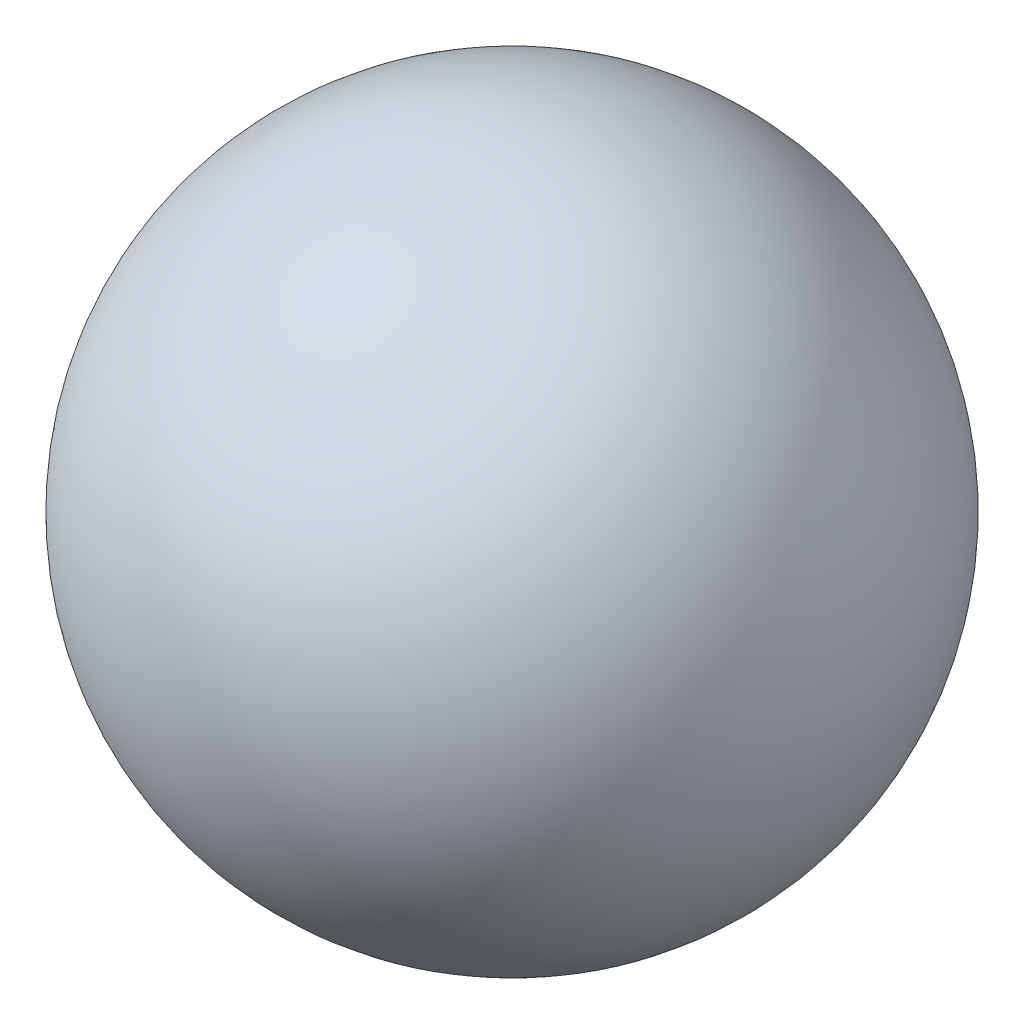
ISO-10303-21;
HEADER;
FILE_DESCRIPTION(('STEP AP214'),'2;1');
FILE_NAME('part.step','',(''),(''),'','','');
FILE_SCHEMA(('AUTOMOTIVE_DESIGN { 1 0 10303 214 1 1 1 1 }'));
ENDSEC;
DATA;
#1=APPLICATION_CONTEXT('core data for automotive mechanical design processes');
#2=APPLICATION_PROTOCOL_DEFINITION('international standard','automotive_design',2000,#1);
#3=PRODUCT_CONTEXT('',#1,'mechanical');
#4=PRODUCT('Part','Part','',(#3));
#5=PRODUCT_RELATED_PRODUCT_CATEGORY('part','',(#4));
#6=PRODUCT_DEFINITION_FORMATION('','',#4);
#7=PRODUCT_DEFINITION_CONTEXT('part definition',#1,'design');
#8=PRODUCT_DEFINITION('design','',#6,#7);
#9=PRODUCT_DEFINITION_SHAPE('','',#8);
#10=(LENGTH_UNIT() NAMED_UNIT(*) SI_UNIT(.MILLI.,.METRE.));
#11=(NAMED_UNIT(*) PLANE_ANGLE_UNIT() SI_UNIT($,.RADIAN.));
#12=(NAMED_UNIT(*) SI_UNIT($,.STERADIAN.) SOLID_ANGLE_UNIT());
#13=UNCERTAINTY_MEASURE_WITH_UNIT(LENGTH_MEASURE(1.E-05),#10,'distance_accuracy_value','');
#14=(GEOMETRIC_REPRESENTATION_CONTEXT(3) GLOBAL_UNCERTAINTY_ASSIGNED_CONTEXT((#13)) GLOBAL_UNIT_ASSIGNED_CONTEXT((#10,
#11,#12)) REPRESENTATION_CONTEXT('',''));
#15=CARTESIAN_POINT('',(0.,0.,0.));
#16=DIRECTION('',(0.,0.,1.));
#17=DIRECTION('',(1.,0.,0.));
#18=AXIS2_PLACEMENT_3D('',#15,#16,#17);
#19=CARTESIAN_POINT('',(0.,0.,0.));
#20=DIRECTION('',(0.,1.,0.));
#21=DIRECTION('',(1.,0.,0.));
#22=AXIS2_PLACEMENT_3D('',#19,#20,#21);
#23=SPHERICAL_SURFACE('',#22,21.25);
#24=CARTESIAN_POINT('',(0.,21.25,0.));
#25=VERTEX_POINT('',#24);
#26=VERTEX_LOOP('',#25);
#27=FACE_BOUND('',#26,.T.);
#28=ADVANCED_FACE('F37',(#27),#23,.T.);
#29=CLOSED_SHELL('',(#28));
#30=MANIFOLD_SOLID_BREP('B2',#29);
#31=ADVANCED_BREP_SHAPE_REPRESENTATION('',(#18,#30),#14);
#32=SHAPE_DEFINITION_REPRESENTATION(#9,#31);
ENDSEC;
END-ISO-10303-21;
